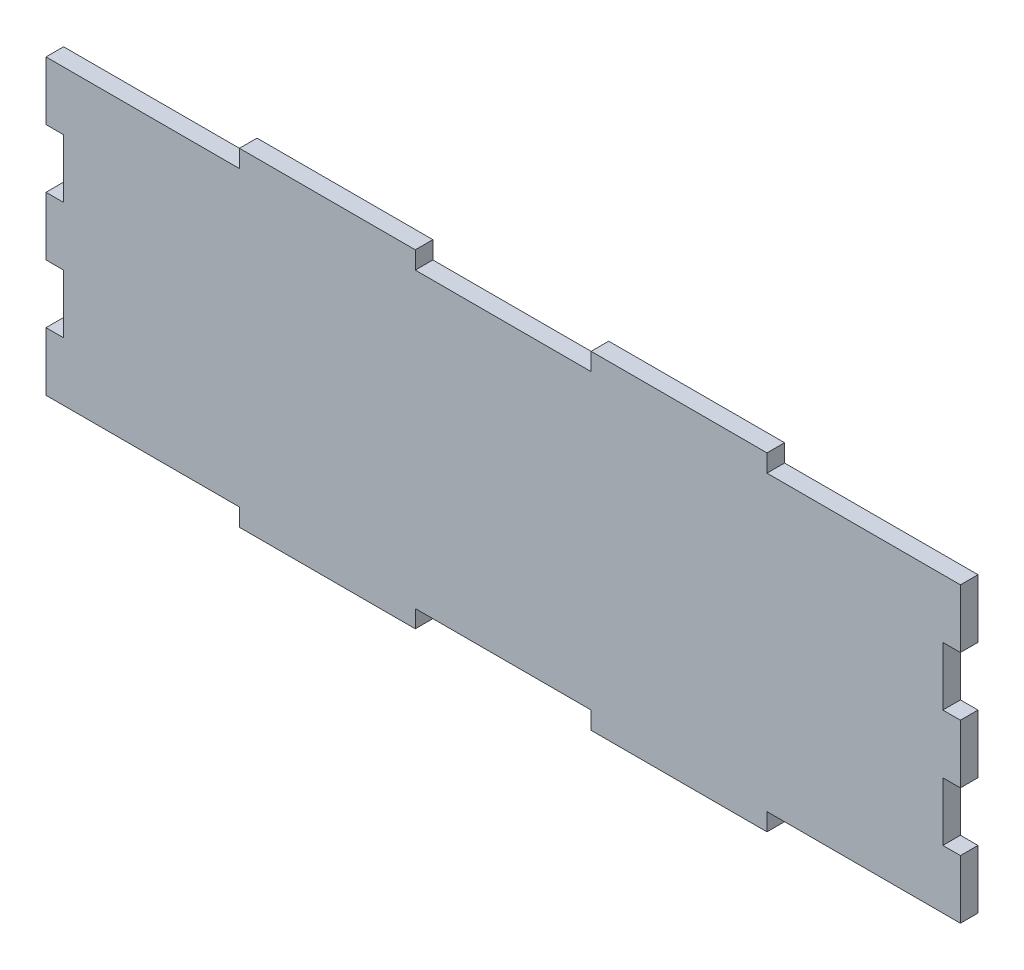
ISO-10303-21;
HEADER;
FILE_DESCRIPTION(('STEP AP214'),'2;1');
FILE_NAME('part.step','',(''),(''),'','','');
FILE_SCHEMA(('AUTOMOTIVE_DESIGN { 1 0 10303 214 1 1 1 1 }'));
ENDSEC;
DATA;
#1=APPLICATION_CONTEXT('core data for automotive mechanical design processes');
#2=APPLICATION_PROTOCOL_DEFINITION('international standard','automotive_design',2000,#1);
#3=PRODUCT_CONTEXT('',#1,'mechanical');
#4=PRODUCT('Part','Part','',(#3));
#5=PRODUCT_RELATED_PRODUCT_CATEGORY('part','',(#4));
#6=PRODUCT_DEFINITION_FORMATION('','',#4);
#7=PRODUCT_DEFINITION_CONTEXT('part definition',#1,'design');
#8=PRODUCT_DEFINITION('design','',#6,#7);
#9=PRODUCT_DEFINITION_SHAPE('','',#8);
#10=(LENGTH_UNIT() NAMED_UNIT(*) SI_UNIT(.MILLI.,.METRE.));
#11=(NAMED_UNIT(*) PLANE_ANGLE_UNIT() SI_UNIT($,.RADIAN.));
#12=(NAMED_UNIT(*) SI_UNIT($,.STERADIAN.) SOLID_ANGLE_UNIT());
#13=UNCERTAINTY_MEASURE_WITH_UNIT(LENGTH_MEASURE(1.E-05),#10,'distance_accuracy_value','');
#14=(GEOMETRIC_REPRESENTATION_CONTEXT(3) GLOBAL_UNCERTAINTY_ASSIGNED_CONTEXT((#13)) GLOBAL_UNIT_ASSIGNED_CONTEXT((#10,
#11,#12)) REPRESENTATION_CONTEXT('',''));
#15=CARTESIAN_POINT('',(0.,0.,0.));
#16=DIRECTION('',(0.,0.,1.));
#17=DIRECTION('',(1.,0.,0.));
#18=AXIS2_PLACEMENT_3D('',#15,#16,#17);
#19=CARTESIAN_POINT('',(45.,25.,3.));
#20=DIRECTION('',(0.,-1.,0.));
#21=DIRECTION('',(0.,0.,-1.));
#22=AXIS2_PLACEMENT_3D('',#19,#20,#21);
#23=PLANE('',#22);
#24=DIRECTION('',(-1.,0.,0.));
#25=VECTOR('',#24,1.);
#26=CARTESIAN_POINT('',(45.,25.,0.));
#27=LINE('',#26,#25);
#28=CARTESIAN_POINT('',(78.,25.,0.));
#29=VERTEX_POINT('',#28);
#30=CARTESIAN_POINT('',(45.,25.,0.));
#31=VERTEX_POINT('',#30);
#32=EDGE_CURVE('E178',#29,#31,#27,.T.);
#33=ORIENTED_EDGE('',*,*,#32,.T.);
#34=DIRECTION('',(0.,0.,-1.));
#35=VECTOR('',#34,1.);
#36=CARTESIAN_POINT('',(45.,25.,3.));
#37=LINE('',#36,#35);
#38=CARTESIAN_POINT('',(45.,25.,3.));
#39=VERTEX_POINT('',#38);
#40=EDGE_CURVE('E11',#39,#31,#37,.T.);
#41=ORIENTED_EDGE('',*,*,#40,.F.);
#42=DIRECTION('',(-1.,0.,0.));
#43=VECTOR('',#42,1.);
#44=CARTESIAN_POINT('',(75.,25.,3.));
#45=LINE('',#44,#43);
#46=CARTESIAN_POINT('',(78.,25.,3.));
#47=VERTEX_POINT('',#46);
#48=EDGE_CURVE('E184',#47,#39,#45,.T.);
#49=ORIENTED_EDGE('',*,*,#48,.F.);
#50=DIRECTION('',(0.,0.,-1.));
#51=VECTOR('',#50,1.);
#52=CARTESIAN_POINT('',(78.,25.,3.));
#53=LINE('',#52,#51);
#54=EDGE_CURVE('E306',#47,#29,#53,.T.);
#55=ORIENTED_EDGE('',*,*,#54,.T.);
#56=EDGE_LOOP('',(#33,#41,#49,#55));
#57=FACE_BOUND('',#56,.T.);
#58=ADVANCED_FACE('F41',(#57),#23,.F.);
#59=CARTESIAN_POINT('',(45.,25.,3.));
#60=DIRECTION('',(-1.,0.,0.));
#61=DIRECTION('',(0.,0.,1.));
#62=AXIS2_PLACEMENT_3D('',#59,#60,#61);
#63=PLANE('',#62);
#64=DIRECTION('',(0.,1.,0.));
#65=VECTOR('',#64,1.);
#66=CARTESIAN_POINT('',(45.,25.,0.));
#67=LINE('',#66,#65);
#68=CARTESIAN_POINT('',(45.,28.,0.));
#69=VERTEX_POINT('',#68);
#70=EDGE_CURVE('E312',#31,#69,#67,.T.);
#71=ORIENTED_EDGE('',*,*,#70,.T.);
#72=DIRECTION('',(0.,0.,-1.));
#73=VECTOR('',#72,1.);
#74=CARTESIAN_POINT('',(45.,28.,3.));
#75=LINE('',#74,#73);
#76=CARTESIAN_POINT('',(45.,28.,3.));
#77=VERTEX_POINT('',#76);
#78=EDGE_CURVE('E50',#77,#69,#75,.T.);
#79=ORIENTED_EDGE('',*,*,#78,.F.);
#80=DIRECTION('',(0.,1.,0.));
#81=VECTOR('',#80,1.);
#82=CARTESIAN_POINT('',(45.,25.,3.));
#83=LINE('',#82,#81);
#84=EDGE_CURVE('E671',#39,#77,#83,.T.);
#85=ORIENTED_EDGE('',*,*,#84,.F.);
#86=ORIENTED_EDGE('',*,*,#40,.T.);
#87=EDGE_LOOP('',(#71,#79,#85,#86));
#88=FACE_BOUND('',#87,.T.);
#89=ADVANCED_FACE('F676',(#88),#63,.F.);
#90=CARTESIAN_POINT('',(15.,28.,3.));
#91=DIRECTION('',(0.,-1.,0.));
#92=DIRECTION('',(0.,0.,-1.));
#93=AXIS2_PLACEMENT_3D('',#90,#91,#92);
#94=PLANE('',#93);
#95=DIRECTION('',(-1.,0.,0.));
#96=VECTOR('',#95,1.);
#97=CARTESIAN_POINT('',(15.,28.,0.));
#98=LINE('',#97,#96);
#99=CARTESIAN_POINT('',(15.,28.,0.));
#100=VERTEX_POINT('',#99);
#101=EDGE_CURVE('E315',#69,#100,#98,.T.);
#102=ORIENTED_EDGE('',*,*,#101,.T.);
#103=DIRECTION('',(0.,0.,-1.));
#104=VECTOR('',#103,1.);
#105=CARTESIAN_POINT('',(15.,28.,3.));
#106=LINE('',#105,#104);
#107=CARTESIAN_POINT('',(15.,28.,3.));
#108=VERTEX_POINT('',#107);
#109=EDGE_CURVE('E541',#108,#100,#106,.T.);
#110=ORIENTED_EDGE('',*,*,#109,.F.);
#111=DIRECTION('',(-1.,0.,0.));
#112=VECTOR('',#111,1.);
#113=CARTESIAN_POINT('',(15.,28.,3.));
#114=LINE('',#113,#112);
#115=EDGE_CURVE('E552',#77,#108,#114,.T.);
#116=ORIENTED_EDGE('',*,*,#115,.F.);
#117=ORIENTED_EDGE('',*,*,#78,.T.);
#118=EDGE_LOOP('',(#102,#110,#116,#117));
#119=FACE_BOUND('',#118,.T.);
#120=ADVANCED_FACE('F550',(#119),#94,.F.);
#121=CARTESIAN_POINT('',(15.,25.,3.));
#122=DIRECTION('',(1.,0.,0.));
#123=DIRECTION('',(0.,0.,-1.));
#124=AXIS2_PLACEMENT_3D('',#121,#122,#123);
#125=PLANE('',#124);
#126=DIRECTION('',(0.,-1.,0.));
#127=VECTOR('',#126,1.);
#128=CARTESIAN_POINT('',(15.,25.,0.));
#129=LINE('',#128,#127);
#130=CARTESIAN_POINT('',(15.,25.,0.));
#131=VERTEX_POINT('',#130);
#132=EDGE_CURVE('E318',#100,#131,#129,.T.);
#133=ORIENTED_EDGE('',*,*,#132,.T.);
#134=DIRECTION('',(0.,0.,-1.));
#135=VECTOR('',#134,1.);
#136=CARTESIAN_POINT('',(15.,25.,3.));
#137=LINE('',#136,#135);
#138=CARTESIAN_POINT('',(15.,25.,3.));
#139=VERTEX_POINT('',#138);
#140=EDGE_CURVE('E537',#139,#131,#137,.T.);
#141=ORIENTED_EDGE('',*,*,#140,.F.);
#142=DIRECTION('',(0.,-1.,0.));
#143=VECTOR('',#142,1.);
#144=CARTESIAN_POINT('',(15.,25.,3.));
#145=LINE('',#144,#143);
#146=EDGE_CURVE('E571',#108,#139,#145,.T.);
#147=ORIENTED_EDGE('',*,*,#146,.F.);
#148=ORIENTED_EDGE('',*,*,#109,.T.);
#149=EDGE_LOOP('',(#133,#141,#147,#148));
#150=FACE_BOUND('',#149,.T.);
#151=ADVANCED_FACE('F561',(#150),#125,.F.);
#152=CARTESIAN_POINT('',(-15.,25.,3.));
#153=DIRECTION('',(0.,-1.,0.));
#154=DIRECTION('',(0.,0.,-1.));
#155=AXIS2_PLACEMENT_3D('',#152,#153,#154);
#156=PLANE('',#155);
#157=DIRECTION('',(-1.,0.,0.));
#158=VECTOR('',#157,1.);
#159=CARTESIAN_POINT('',(-15.,25.,0.));
#160=LINE('',#159,#158);
#161=CARTESIAN_POINT('',(-15.,25.,0.));
#162=VERTEX_POINT('',#161);
#163=EDGE_CURVE('E321',#131,#162,#160,.T.);
#164=ORIENTED_EDGE('',*,*,#163,.T.);
#165=DIRECTION('',(0.,0.,-1.));
#166=VECTOR('',#165,1.);
#167=CARTESIAN_POINT('',(-15.,25.,3.));
#168=LINE('',#167,#166);
#169=CARTESIAN_POINT('',(-15.,25.,3.));
#170=VERTEX_POINT('',#169);
#171=EDGE_CURVE('E533',#170,#162,#168,.T.);
#172=ORIENTED_EDGE('',*,*,#171,.F.);
#173=DIRECTION('',(-1.,0.,0.));
#174=VECTOR('',#173,1.);
#175=CARTESIAN_POINT('',(-15.,25.,3.));
#176=LINE('',#175,#174);
#177=EDGE_CURVE('E567',#139,#170,#176,.T.);
#178=ORIENTED_EDGE('',*,*,#177,.F.);
#179=ORIENTED_EDGE('',*,*,#140,.T.);
#180=EDGE_LOOP('',(#164,#172,#178,#179));
#181=FACE_BOUND('',#180,.T.);
#182=ADVANCED_FACE('F565',(#181),#156,.F.);
#183=CARTESIAN_POINT('',(-15.,25.,3.));
#184=DIRECTION('',(-1.,0.,0.));
#185=DIRECTION('',(0.,0.,1.));
#186=AXIS2_PLACEMENT_3D('',#183,#184,#185);
#187=PLANE('',#186);
#188=DIRECTION('',(0.,1.,0.));
#189=VECTOR('',#188,1.);
#190=CARTESIAN_POINT('',(-15.,25.,0.));
#191=LINE('',#190,#189);
#192=CARTESIAN_POINT('',(-15.,28.,0.));
#193=VERTEX_POINT('',#192);
#194=EDGE_CURVE('E324',#162,#193,#191,.T.);
#195=ORIENTED_EDGE('',*,*,#194,.T.);
#196=DIRECTION('',(0.,0.,-1.));
#197=VECTOR('',#196,1.);
#198=CARTESIAN_POINT('',(-15.,28.,3.));
#199=LINE('',#198,#197);
#200=CARTESIAN_POINT('',(-15.,28.,3.));
#201=VERTEX_POINT('',#200);
#202=EDGE_CURVE('E529',#201,#193,#199,.T.);
#203=ORIENTED_EDGE('',*,*,#202,.F.);
#204=DIRECTION('',(0.,1.,0.));
#205=VECTOR('',#204,1.);
#206=CARTESIAN_POINT('',(-15.,25.,3.));
#207=LINE('',#206,#205);
#208=EDGE_CURVE('E570',#170,#201,#207,.T.);
#209=ORIENTED_EDGE('',*,*,#208,.F.);
#210=ORIENTED_EDGE('',*,*,#171,.T.);
#211=EDGE_LOOP('',(#195,#203,#209,#210));
#212=FACE_BOUND('',#211,.T.);
#213=ADVANCED_FACE('F688',(#212),#187,.F.);
#214=CARTESIAN_POINT('',(-45.,28.,3.));
#215=DIRECTION('',(0.,-1.,0.));
#216=DIRECTION('',(0.,0.,-1.));
#217=AXIS2_PLACEMENT_3D('',#214,#215,#216);
#218=PLANE('',#217);
#219=DIRECTION('',(-1.,0.,0.));
#220=VECTOR('',#219,1.);
#221=CARTESIAN_POINT('',(-45.,28.,0.));
#222=LINE('',#221,#220);
#223=CARTESIAN_POINT('',(-45.,28.,0.));
#224=VERTEX_POINT('',#223);
#225=EDGE_CURVE('E327',#193,#224,#222,.T.);
#226=ORIENTED_EDGE('',*,*,#225,.T.);
#227=DIRECTION('',(0.,0.,-1.));
#228=VECTOR('',#227,1.);
#229=CARTESIAN_POINT('',(-45.,28.,3.));
#230=LINE('',#229,#228);
#231=CARTESIAN_POINT('',(-45.,28.,3.));
#232=VERTEX_POINT('',#231);
#233=EDGE_CURVE('E525',#232,#224,#230,.T.);
#234=ORIENTED_EDGE('',*,*,#233,.F.);
#235=DIRECTION('',(-1.,0.,0.));
#236=VECTOR('',#235,1.);
#237=CARTESIAN_POINT('',(-45.,28.,3.));
#238=LINE('',#237,#236);
#239=EDGE_CURVE('E575',#201,#232,#238,.T.);
#240=ORIENTED_EDGE('',*,*,#239,.F.);
#241=ORIENTED_EDGE('',*,*,#202,.T.);
#242=EDGE_LOOP('',(#226,#234,#240,#241));
#243=FACE_BOUND('',#242,.T.);
#244=ADVANCED_FACE('F691',(#243),#218,.F.);
#245=CARTESIAN_POINT('',(-45.,25.,3.));
#246=DIRECTION('',(1.,0.,0.));
#247=DIRECTION('',(0.,0.,-1.));
#248=AXIS2_PLACEMENT_3D('',#245,#246,#247);
#249=PLANE('',#248);
#250=DIRECTION('',(0.,-1.,0.));
#251=VECTOR('',#250,1.);
#252=CARTESIAN_POINT('',(-45.,25.,0.));
#253=LINE('',#252,#251);
#254=CARTESIAN_POINT('',(-45.,25.,0.));
#255=VERTEX_POINT('',#254);
#256=EDGE_CURVE('E330',#224,#255,#253,.T.);
#257=ORIENTED_EDGE('',*,*,#256,.T.);
#258=DIRECTION('',(0.,0.,-1.));
#259=VECTOR('',#258,1.);
#260=CARTESIAN_POINT('',(-45.,25.,3.));
#261=LINE('',#260,#259);
#262=CARTESIAN_POINT('',(-45.,25.,3.));
#263=VERTEX_POINT('',#262);
#264=EDGE_CURVE('E521',#263,#255,#261,.T.);
#265=ORIENTED_EDGE('',*,*,#264,.F.);
#266=DIRECTION('',(0.,-1.,0.));
#267=VECTOR('',#266,1.);
#268=CARTESIAN_POINT('',(-45.,25.,3.));
#269=LINE('',#268,#267);
#270=EDGE_CURVE('E582',#232,#263,#269,.T.);
#271=ORIENTED_EDGE('',*,*,#270,.F.);
#272=ORIENTED_EDGE('',*,*,#233,.T.);
#273=EDGE_LOOP('',(#257,#265,#271,#272));
#274=FACE_BOUND('',#273,.T.);
#275=ADVANCED_FACE('F695',(#274),#249,.F.);
#276=CARTESIAN_POINT('',(-75.,25.,3.));
#277=DIRECTION('',(0.,-1.,0.));
#278=DIRECTION('',(1.,0.,0.));
#279=AXIS2_PLACEMENT_3D('',#276,#277,#278);
#280=PLANE('',#279);
#281=DIRECTION('',(-1.,0.,0.));
#282=VECTOR('',#281,1.);
#283=CARTESIAN_POINT('',(-75.,25.,0.));
#284=LINE('',#283,#282);
#285=CARTESIAN_POINT('',(-78.,25.,0.));
#286=VERTEX_POINT('',#285);
#287=EDGE_CURVE('E334',#255,#286,#284,.T.);
#288=ORIENTED_EDGE('',*,*,#287,.T.);
#289=DIRECTION('',(0.,0.,-1.));
#290=VECTOR('',#289,1.);
#291=CARTESIAN_POINT('',(-78.,25.,3.));
#292=LINE('',#291,#290);
#293=CARTESIAN_POINT('',(-78.,25.,3.));
#294=VERTEX_POINT('',#293);
#295=EDGE_CURVE('E517',#294,#286,#292,.T.);
#296=ORIENTED_EDGE('',*,*,#295,.F.);
#297=DIRECTION('',(-1.,0.,0.));
#298=VECTOR('',#297,1.);
#299=CARTESIAN_POINT('',(-75.,25.,3.));
#300=LINE('',#299,#298);
#301=EDGE_CURVE('E585',#263,#294,#300,.T.);
#302=ORIENTED_EDGE('',*,*,#301,.F.);
#303=ORIENTED_EDGE('',*,*,#264,.T.);
#304=EDGE_LOOP('',(#288,#296,#302,#303));
#305=FACE_BOUND('',#304,.T.);
#306=ADVANCED_FACE('F699',(#305),#280,.F.);
#307=CARTESIAN_POINT('',(-78.,25.,3.));
#308=DIRECTION('',(1.,0.,0.));
#309=DIRECTION('',(0.,0.,-1.));
#310=AXIS2_PLACEMENT_3D('',#307,#308,#309);
#311=PLANE('',#310);
#312=DIRECTION('',(0.,-1.,0.));
#313=VECTOR('',#312,1.);
#314=CARTESIAN_POINT('',(-78.,25.,0.));
#315=LINE('',#314,#313);
#316=CARTESIAN_POINT('',(-78.,15.,0.));
#317=VERTEX_POINT('',#316);
#318=EDGE_CURVE('E337',#286,#317,#315,.T.);
#319=ORIENTED_EDGE('',*,*,#318,.T.);
#320=DIRECTION('',(0.,0.,-1.));
#321=VECTOR('',#320,1.);
#322=CARTESIAN_POINT('',(-78.,15.,3.));
#323=LINE('',#322,#321);
#324=CARTESIAN_POINT('',(-78.,15.,3.));
#325=VERTEX_POINT('',#324);
#326=EDGE_CURVE('E513',#325,#317,#323,.T.);
#327=ORIENTED_EDGE('',*,*,#326,.F.);
#328=DIRECTION('',(0.,-1.,0.));
#329=VECTOR('',#328,1.);
#330=CARTESIAN_POINT('',(-78.,25.,3.));
#331=LINE('',#330,#329);
#332=EDGE_CURVE('E588',#294,#325,#331,.T.);
#333=ORIENTED_EDGE('',*,*,#332,.F.);
#334=ORIENTED_EDGE('',*,*,#295,.T.);
#335=EDGE_LOOP('',(#319,#327,#333,#334));
#336=FACE_BOUND('',#335,.T.);
#337=ADVANCED_FACE('F703',(#336),#311,.F.);
#338=CARTESIAN_POINT('',(-78.,15.,3.));
#339=DIRECTION('',(0.,1.,0.));
#340=DIRECTION('',(-1.,0.,0.));
#341=AXIS2_PLACEMENT_3D('',#338,#339,#340);
#342=PLANE('',#341);
#343=DIRECTION('',(1.,0.,0.));
#344=VECTOR('',#343,1.);
#345=CARTESIAN_POINT('',(-78.,15.,0.));
#346=LINE('',#345,#344);
#347=CARTESIAN_POINT('',(-75.,15.,0.));
#348=VERTEX_POINT('',#347);
#349=EDGE_CURVE('E340',#317,#348,#346,.T.);
#350=ORIENTED_EDGE('',*,*,#349,.T.);
#351=DIRECTION('',(0.,0.,-1.));
#352=VECTOR('',#351,1.);
#353=CARTESIAN_POINT('',(-75.,15.,3.));
#354=LINE('',#353,#352);
#355=CARTESIAN_POINT('',(-75.,15.,3.));
#356=VERTEX_POINT('',#355);
#357=EDGE_CURVE('E509',#356,#348,#354,.T.);
#358=ORIENTED_EDGE('',*,*,#357,.F.);
#359=DIRECTION('',(1.,0.,0.));
#360=VECTOR('',#359,1.);
#361=CARTESIAN_POINT('',(-78.,15.,3.));
#362=LINE('',#361,#360);
#363=EDGE_CURVE('E591',#325,#356,#362,.T.);
#364=ORIENTED_EDGE('',*,*,#363,.F.);
#365=ORIENTED_EDGE('',*,*,#326,.T.);
#366=EDGE_LOOP('',(#350,#358,#364,#365));
#367=FACE_BOUND('',#366,.T.);
#368=ADVANCED_FACE('F707',(#367),#342,.F.);
#369=CARTESIAN_POINT('',(-75.,15.,3.));
#370=DIRECTION('',(1.,0.,0.));
#371=DIRECTION('',(0.,0.,-1.));
#372=AXIS2_PLACEMENT_3D('',#369,#370,#371);
#373=PLANE('',#372);
#374=DIRECTION('',(0.,-1.,0.));
#375=VECTOR('',#374,1.);
#376=CARTESIAN_POINT('',(-75.,15.,0.));
#377=LINE('',#376,#375);
#378=CARTESIAN_POINT('',(-75.,4.99999999999999,0.));
#379=VERTEX_POINT('',#378);
#380=EDGE_CURVE('E343',#348,#379,#377,.T.);
#381=ORIENTED_EDGE('',*,*,#380,.T.);
#382=DIRECTION('',(0.,0.,-1.));
#383=VECTOR('',#382,1.);
#384=CARTESIAN_POINT('',(-75.,4.99999999999999,3.));
#385=LINE('',#384,#383);
#386=CARTESIAN_POINT('',(-75.,4.99999999999999,3.));
#387=VERTEX_POINT('',#386);
#388=EDGE_CURVE('E505',#387,#379,#385,.T.);
#389=ORIENTED_EDGE('',*,*,#388,.F.);
#390=DIRECTION('',(0.,-1.,0.));
#391=VECTOR('',#390,1.);
#392=CARTESIAN_POINT('',(-75.,15.,3.));
#393=LINE('',#392,#391);
#394=EDGE_CURVE('E594',#356,#387,#393,.T.);
#395=ORIENTED_EDGE('',*,*,#394,.F.);
#396=ORIENTED_EDGE('',*,*,#357,.T.);
#397=EDGE_LOOP('',(#381,#389,#395,#396));
#398=FACE_BOUND('',#397,.T.);
#399=ADVANCED_FACE('F711',(#398),#373,.F.);
#400=CARTESIAN_POINT('',(-75.,4.99999999999999,3.));
#401=DIRECTION('',(0.,-1.,0.));
#402=DIRECTION('',(0.,0.,-1.));
#403=AXIS2_PLACEMENT_3D('',#400,#401,#402);
#404=PLANE('',#403);
#405=DIRECTION('',(-1.,0.,0.));
#406=VECTOR('',#405,1.);
#407=CARTESIAN_POINT('',(-75.,4.99999999999999,0.));
#408=LINE('',#407,#406);
#409=CARTESIAN_POINT('',(-78.,4.99999999999999,0.));
#410=VERTEX_POINT('',#409);
#411=EDGE_CURVE('E346',#379,#410,#408,.T.);
#412=ORIENTED_EDGE('',*,*,#411,.T.);
#413=DIRECTION('',(0.,0.,-1.));
#414=VECTOR('',#413,1.);
#415=CARTESIAN_POINT('',(-78.,4.99999999999999,3.));
#416=LINE('',#415,#414);
#417=CARTESIAN_POINT('',(-78.,4.99999999999999,3.));
#418=VERTEX_POINT('',#417);
#419=EDGE_CURVE('E501',#418,#410,#416,.T.);
#420=ORIENTED_EDGE('',*,*,#419,.F.);
#421=DIRECTION('',(-1.,0.,0.));
#422=VECTOR('',#421,1.);
#423=CARTESIAN_POINT('',(-75.,4.99999999999999,3.));
#424=LINE('',#423,#422);
#425=EDGE_CURVE('E597',#387,#418,#424,.T.);
#426=ORIENTED_EDGE('',*,*,#425,.F.);
#427=ORIENTED_EDGE('',*,*,#388,.T.);
#428=EDGE_LOOP('',(#412,#420,#426,#427));
#429=FACE_BOUND('',#428,.T.);
#430=ADVANCED_FACE('F715',(#429),#404,.F.);
#431=CARTESIAN_POINT('',(-78.,4.99999999999999,3.));
#432=DIRECTION('',(1.,0.,0.));
#433=DIRECTION('',(0.,0.,-1.));
#434=AXIS2_PLACEMENT_3D('',#431,#432,#433);
#435=PLANE('',#434);
#436=DIRECTION('',(0.,-1.,0.));
#437=VECTOR('',#436,1.);
#438=CARTESIAN_POINT('',(-78.,4.99999999999999,0.));
#439=LINE('',#438,#437);
#440=CARTESIAN_POINT('',(-78.,-5.00000000000001,0.));
#441=VERTEX_POINT('',#440);
#442=EDGE_CURVE('E349',#410,#441,#439,.T.);
#443=ORIENTED_EDGE('',*,*,#442,.T.);
#444=DIRECTION('',(0.,0.,-1.));
#445=VECTOR('',#444,1.);
#446=CARTESIAN_POINT('',(-78.,-5.00000000000001,3.));
#447=LINE('',#446,#445);
#448=CARTESIAN_POINT('',(-78.,-5.00000000000001,3.));
#449=VERTEX_POINT('',#448);
#450=EDGE_CURVE('E497',#449,#441,#447,.T.);
#451=ORIENTED_EDGE('',*,*,#450,.F.);
#452=DIRECTION('',(0.,-1.,0.));
#453=VECTOR('',#452,1.);
#454=CARTESIAN_POINT('',(-78.,4.99999999999999,3.));
#455=LINE('',#454,#453);
#456=EDGE_CURVE('E600',#418,#449,#455,.T.);
#457=ORIENTED_EDGE('',*,*,#456,.F.);
#458=ORIENTED_EDGE('',*,*,#419,.T.);
#459=EDGE_LOOP('',(#443,#451,#457,#458));
#460=FACE_BOUND('',#459,.T.);
#461=ADVANCED_FACE('F719',(#460),#435,.F.);
#462=CARTESIAN_POINT('',(-78.,-5.00000000000001,3.));
#463=DIRECTION('',(0.,1.,0.));
#464=DIRECTION('',(-1.,0.,0.));
#465=AXIS2_PLACEMENT_3D('',#462,#463,#464);
#466=PLANE('',#465);
#467=DIRECTION('',(1.,0.,0.));
#468=VECTOR('',#467,1.);
#469=CARTESIAN_POINT('',(-78.,-5.00000000000001,0.));
#470=LINE('',#469,#468);
#471=CARTESIAN_POINT('',(-75.,-5.00000000000001,0.));
#472=VERTEX_POINT('',#471);
#473=EDGE_CURVE('E352',#441,#472,#470,.T.);
#474=ORIENTED_EDGE('',*,*,#473,.T.);
#475=DIRECTION('',(0.,0.,-1.));
#476=VECTOR('',#475,1.);
#477=CARTESIAN_POINT('',(-75.,-5.00000000000001,3.));
#478=LINE('',#477,#476);
#479=CARTESIAN_POINT('',(-75.,-5.00000000000001,3.));
#480=VERTEX_POINT('',#479);
#481=EDGE_CURVE('E493',#480,#472,#478,.T.);
#482=ORIENTED_EDGE('',*,*,#481,.F.);
#483=DIRECTION('',(1.,0.,0.));
#484=VECTOR('',#483,1.);
#485=CARTESIAN_POINT('',(-78.,-5.00000000000001,3.));
#486=LINE('',#485,#484);
#487=EDGE_CURVE('E603',#449,#480,#486,.T.);
#488=ORIENTED_EDGE('',*,*,#487,.F.);
#489=ORIENTED_EDGE('',*,*,#450,.T.);
#490=EDGE_LOOP('',(#474,#482,#488,#489));
#491=FACE_BOUND('',#490,.T.);
#492=ADVANCED_FACE('F723',(#491),#466,.F.);
#493=CARTESIAN_POINT('',(-75.,-5.00000000000001,3.));
#494=DIRECTION('',(1.,0.,0.));
#495=DIRECTION('',(0.,1.,0.));
#496=AXIS2_PLACEMENT_3D('',#493,#494,#495);
#497=PLANE('',#496);
#498=DIRECTION('',(0.,-1.,0.));
#499=VECTOR('',#498,1.);
#500=CARTESIAN_POINT('',(-75.,-5.00000000000001,0.));
#501=LINE('',#500,#499);
#502=CARTESIAN_POINT('',(-75.,-15.,0.));
#503=VERTEX_POINT('',#502);
#504=EDGE_CURVE('E355',#472,#503,#501,.T.);
#505=ORIENTED_EDGE('',*,*,#504,.T.);
#506=DIRECTION('',(0.,0.,-1.));
#507=VECTOR('',#506,1.);
#508=CARTESIAN_POINT('',(-75.,-15.,3.));
#509=LINE('',#508,#507);
#510=CARTESIAN_POINT('',(-75.,-15.,3.));
#511=VERTEX_POINT('',#510);
#512=EDGE_CURVE('E489',#511,#503,#509,.T.);
#513=ORIENTED_EDGE('',*,*,#512,.F.);
#514=DIRECTION('',(0.,-1.,0.));
#515=VECTOR('',#514,1.);
#516=CARTESIAN_POINT('',(-75.,-5.00000000000001,3.));
#517=LINE('',#516,#515);
#518=EDGE_CURVE('E606',#480,#511,#517,.T.);
#519=ORIENTED_EDGE('',*,*,#518,.F.);
#520=ORIENTED_EDGE('',*,*,#481,.T.);
#521=EDGE_LOOP('',(#505,#513,#519,#520));
#522=FACE_BOUND('',#521,.T.);
#523=ADVANCED_FACE('F727',(#522),#497,.F.);
#524=CARTESIAN_POINT('',(-75.,-15.,3.));
#525=DIRECTION('',(0.,-1.,0.));
#526=DIRECTION('',(1.,0.,0.));
#527=AXIS2_PLACEMENT_3D('',#524,#525,#526);
#528=PLANE('',#527);
#529=DIRECTION('',(-1.,0.,0.));
#530=VECTOR('',#529,1.);
#531=CARTESIAN_POINT('',(-75.,-15.,0.));
#532=LINE('',#531,#530);
#533=CARTESIAN_POINT('',(-78.,-15.,0.));
#534=VERTEX_POINT('',#533);
#535=EDGE_CURVE('E358',#503,#534,#532,.T.);
#536=ORIENTED_EDGE('',*,*,#535,.T.);
#537=DIRECTION('',(0.,0.,-1.));
#538=VECTOR('',#537,1.);
#539=CARTESIAN_POINT('',(-78.,-15.,3.));
#540=LINE('',#539,#538);
#541=CARTESIAN_POINT('',(-78.,-15.,3.));
#542=VERTEX_POINT('',#541);
#543=EDGE_CURVE('E485',#542,#534,#540,.T.);
#544=ORIENTED_EDGE('',*,*,#543,.F.);
#545=DIRECTION('',(-1.,0.,0.));
#546=VECTOR('',#545,1.);
#547=CARTESIAN_POINT('',(-75.,-15.,3.));
#548=LINE('',#547,#546);
#549=EDGE_CURVE('E609',#511,#542,#548,.T.);
#550=ORIENTED_EDGE('',*,*,#549,.F.);
#551=ORIENTED_EDGE('',*,*,#512,.T.);
#552=EDGE_LOOP('',(#536,#544,#550,#551));
#553=FACE_BOUND('',#552,.T.);
#554=ADVANCED_FACE('F731',(#553),#528,.F.);
#555=CARTESIAN_POINT('',(-78.,-15.,3.));
#556=DIRECTION('',(1.,0.,0.));
#557=DIRECTION('',(0.,0.,-1.));
#558=AXIS2_PLACEMENT_3D('',#555,#556,#557);
#559=PLANE('',#558);
#560=DIRECTION('',(0.,-1.,0.));
#561=VECTOR('',#560,1.);
#562=CARTESIAN_POINT('',(-78.,-15.,0.));
#563=LINE('',#562,#561);
#564=CARTESIAN_POINT('',(-78.,-25.,0.));
#565=VERTEX_POINT('',#564);
#566=EDGE_CURVE('E361',#534,#565,#563,.T.);
#567=ORIENTED_EDGE('',*,*,#566,.T.);
#568=DIRECTION('',(0.,0.,-1.));
#569=VECTOR('',#568,1.);
#570=CARTESIAN_POINT('',(-78.,-25.,3.));
#571=LINE('',#570,#569);
#572=CARTESIAN_POINT('',(-78.,-25.,3.));
#573=VERTEX_POINT('',#572);
#574=EDGE_CURVE('E481',#573,#565,#571,.T.);
#575=ORIENTED_EDGE('',*,*,#574,.F.);
#576=DIRECTION('',(0.,-1.,0.));
#577=VECTOR('',#576,1.);
#578=CARTESIAN_POINT('',(-78.,-15.,3.));
#579=LINE('',#578,#577);
#580=EDGE_CURVE('E612',#542,#573,#579,.T.);
#581=ORIENTED_EDGE('',*,*,#580,.F.);
#582=ORIENTED_EDGE('',*,*,#543,.T.);
#583=EDGE_LOOP('',(#567,#575,#581,#582));
#584=FACE_BOUND('',#583,.T.);
#585=ADVANCED_FACE('F735',(#584),#559,.F.);
#586=CARTESIAN_POINT('',(-75.,-25.,3.));
#587=DIRECTION('',(0.,1.,0.));
#588=DIRECTION('',(-1.,0.,0.));
#589=AXIS2_PLACEMENT_3D('',#586,#587,#588);
#590=PLANE('',#589);
#591=DIRECTION('',(1.,0.,0.));
#592=VECTOR('',#591,1.);
#593=CARTESIAN_POINT('',(-75.,-25.,0.));
#594=LINE('',#593,#592);
#595=CARTESIAN_POINT('',(-45.,-25.,0.));
#596=VERTEX_POINT('',#595);
#597=EDGE_CURVE('E365',#565,#596,#594,.T.);
#598=ORIENTED_EDGE('',*,*,#597,.T.);
#599=DIRECTION('',(0.,0.,-1.));
#600=VECTOR('',#599,1.);
#601=CARTESIAN_POINT('',(-45.,-25.,3.));
#602=LINE('',#601,#600);
#603=CARTESIAN_POINT('',(-45.,-25.,3.));
#604=VERTEX_POINT('',#603);
#605=EDGE_CURVE('E477',#604,#596,#602,.T.);
#606=ORIENTED_EDGE('',*,*,#605,.F.);
#607=DIRECTION('',(1.,0.,0.));
#608=VECTOR('',#607,1.);
#609=CARTESIAN_POINT('',(-78.,-25.,3.));
#610=LINE('',#609,#608);
#611=EDGE_CURVE('E615',#573,#604,#610,.T.);
#612=ORIENTED_EDGE('',*,*,#611,.F.);
#613=ORIENTED_EDGE('',*,*,#574,.T.);
#614=EDGE_LOOP('',(#598,#606,#612,#613));
#615=FACE_BOUND('',#614,.T.);
#616=ADVANCED_FACE('F739',(#615),#590,.F.);
#617=CARTESIAN_POINT('',(-45.,-25.,3.));
#618=DIRECTION('',(1.,0.,0.));
#619=DIRECTION('',(0.,0.,-1.));
#620=AXIS2_PLACEMENT_3D('',#617,#618,#619);
#621=PLANE('',#620);
#622=DIRECTION('',(0.,-1.,0.));
#623=VECTOR('',#622,1.);
#624=CARTESIAN_POINT('',(-45.,-25.,0.));
#625=LINE('',#624,#623);
#626=CARTESIAN_POINT('',(-45.,-28.,0.));
#627=VERTEX_POINT('',#626);
#628=EDGE_CURVE('E368',#596,#627,#625,.T.);
#629=ORIENTED_EDGE('',*,*,#628,.T.);
#630=DIRECTION('',(0.,0.,-1.));
#631=VECTOR('',#630,1.);
#632=CARTESIAN_POINT('',(-45.,-28.,3.));
#633=LINE('',#632,#631);
#634=CARTESIAN_POINT('',(-45.,-28.,3.));
#635=VERTEX_POINT('',#634);
#636=EDGE_CURVE('E473',#635,#627,#633,.T.);
#637=ORIENTED_EDGE('',*,*,#636,.F.);
#638=DIRECTION('',(0.,-1.,0.));
#639=VECTOR('',#638,1.);
#640=CARTESIAN_POINT('',(-45.,-25.,3.));
#641=LINE('',#640,#639);
#642=EDGE_CURVE('E618',#604,#635,#641,.T.);
#643=ORIENTED_EDGE('',*,*,#642,.F.);
#644=ORIENTED_EDGE('',*,*,#605,.T.);
#645=EDGE_LOOP('',(#629,#637,#643,#644));
#646=FACE_BOUND('',#645,.T.);
#647=ADVANCED_FACE('F743',(#646),#621,.F.);
#648=CARTESIAN_POINT('',(-45.,-28.,3.));
#649=DIRECTION('',(0.,1.,0.));
#650=DIRECTION('',(-1.,0.,0.));
#651=AXIS2_PLACEMENT_3D('',#648,#649,#650);
#652=PLANE('',#651);
#653=DIRECTION('',(1.,0.,0.));
#654=VECTOR('',#653,1.);
#655=CARTESIAN_POINT('',(-45.,-28.,0.));
#656=LINE('',#655,#654);
#657=CARTESIAN_POINT('',(-15.,-28.,0.));
#658=VERTEX_POINT('',#657);
#659=EDGE_CURVE('E371',#627,#658,#656,.T.);
#660=ORIENTED_EDGE('',*,*,#659,.T.);
#661=DIRECTION('',(0.,0.,-1.));
#662=VECTOR('',#661,1.);
#663=CARTESIAN_POINT('',(-15.,-28.,3.));
#664=LINE('',#663,#662);
#665=CARTESIAN_POINT('',(-15.,-28.,3.));
#666=VERTEX_POINT('',#665);
#667=EDGE_CURVE('E469',#666,#658,#664,.T.);
#668=ORIENTED_EDGE('',*,*,#667,.F.);
#669=DIRECTION('',(1.,0.,0.));
#670=VECTOR('',#669,1.);
#671=CARTESIAN_POINT('',(-45.,-28.,3.));
#672=LINE('',#671,#670);
#673=EDGE_CURVE('E621',#635,#666,#672,.T.);
#674=ORIENTED_EDGE('',*,*,#673,.F.);
#675=ORIENTED_EDGE('',*,*,#636,.T.);
#676=EDGE_LOOP('',(#660,#668,#674,#675));
#677=FACE_BOUND('',#676,.T.);
#678=ADVANCED_FACE('F747',(#677),#652,.F.);
#679=CARTESIAN_POINT('',(-15.,-25.,3.));
#680=DIRECTION('',(-1.,0.,0.));
#681=DIRECTION('',(0.,0.,1.));
#682=AXIS2_PLACEMENT_3D('',#679,#680,#681);
#683=PLANE('',#682);
#684=DIRECTION('',(0.,1.,0.));
#685=VECTOR('',#684,1.);
#686=CARTESIAN_POINT('',(-15.,-25.,0.));
#687=LINE('',#686,#685);
#688=CARTESIAN_POINT('',(-15.,-25.,0.));
#689=VERTEX_POINT('',#688);
#690=EDGE_CURVE('E374',#658,#689,#687,.T.);
#691=ORIENTED_EDGE('',*,*,#690,.T.);
#692=DIRECTION('',(0.,0.,-1.));
#693=VECTOR('',#692,1.);
#694=CARTESIAN_POINT('',(-15.,-25.,3.));
#695=LINE('',#694,#693);
#696=CARTESIAN_POINT('',(-15.,-25.,3.));
#697=VERTEX_POINT('',#696);
#698=EDGE_CURVE('E465',#697,#689,#695,.T.);
#699=ORIENTED_EDGE('',*,*,#698,.F.);
#700=DIRECTION('',(0.,1.,0.));
#701=VECTOR('',#700,1.);
#702=CARTESIAN_POINT('',(-15.,-25.,3.));
#703=LINE('',#702,#701);
#704=EDGE_CURVE('E624',#666,#697,#703,.T.);
#705=ORIENTED_EDGE('',*,*,#704,.F.);
#706=ORIENTED_EDGE('',*,*,#667,.T.);
#707=EDGE_LOOP('',(#691,#699,#705,#706));
#708=FACE_BOUND('',#707,.T.);
#709=ADVANCED_FACE('F751',(#708),#683,.F.);
#710=CARTESIAN_POINT('',(-15.,-25.,3.));
#711=DIRECTION('',(0.,1.,0.));
#712=DIRECTION('',(0.,0.,1.));
#713=AXIS2_PLACEMENT_3D('',#710,#711,#712);
#714=PLANE('',#713);
#715=DIRECTION('',(1.,0.,0.));
#716=VECTOR('',#715,1.);
#717=CARTESIAN_POINT('',(-15.,-25.,0.));
#718=LINE('',#717,#716);
#719=CARTESIAN_POINT('',(15.,-25.,0.));
#720=VERTEX_POINT('',#719);
#721=EDGE_CURVE('E377',#689,#720,#718,.T.);
#722=ORIENTED_EDGE('',*,*,#721,.T.);
#723=DIRECTION('',(0.,0.,-1.));
#724=VECTOR('',#723,1.);
#725=CARTESIAN_POINT('',(15.,-25.,3.));
#726=LINE('',#725,#724);
#727=CARTESIAN_POINT('',(15.,-25.,3.));
#728=VERTEX_POINT('',#727);
#729=EDGE_CURVE('E461',#728,#720,#726,.T.);
#730=ORIENTED_EDGE('',*,*,#729,.F.);
#731=DIRECTION('',(1.,0.,0.));
#732=VECTOR('',#731,1.);
#733=CARTESIAN_POINT('',(-15.,-25.,3.));
#734=LINE('',#733,#732);
#735=EDGE_CURVE('E627',#697,#728,#734,.T.);
#736=ORIENTED_EDGE('',*,*,#735,.F.);
#737=ORIENTED_EDGE('',*,*,#698,.T.);
#738=EDGE_LOOP('',(#722,#730,#736,#737));
#739=FACE_BOUND('',#738,.T.);
#740=ADVANCED_FACE('F755',(#739),#714,.F.);
#741=CARTESIAN_POINT('',(15.,-25.,3.));
#742=DIRECTION('',(1.,0.,0.));
#743=DIRECTION('',(0.,0.,-1.));
#744=AXIS2_PLACEMENT_3D('',#741,#742,#743);
#745=PLANE('',#744);
#746=DIRECTION('',(0.,-1.,0.));
#747=VECTOR('',#746,1.);
#748=CARTESIAN_POINT('',(15.,-25.,0.));
#749=LINE('',#748,#747);
#750=CARTESIAN_POINT('',(15.,-28.,0.));
#751=VERTEX_POINT('',#750);
#752=EDGE_CURVE('E380',#720,#751,#749,.T.);
#753=ORIENTED_EDGE('',*,*,#752,.T.);
#754=DIRECTION('',(0.,0.,-1.));
#755=VECTOR('',#754,1.);
#756=CARTESIAN_POINT('',(15.,-28.,3.));
#757=LINE('',#756,#755);
#758=CARTESIAN_POINT('',(15.,-28.,3.));
#759=VERTEX_POINT('',#758);
#760=EDGE_CURVE('E457',#759,#751,#757,.T.);
#761=ORIENTED_EDGE('',*,*,#760,.F.);
#762=DIRECTION('',(0.,-1.,0.));
#763=VECTOR('',#762,1.);
#764=CARTESIAN_POINT('',(15.,-25.,3.));
#765=LINE('',#764,#763);
#766=EDGE_CURVE('E630',#728,#759,#765,.T.);
#767=ORIENTED_EDGE('',*,*,#766,.F.);
#768=ORIENTED_EDGE('',*,*,#729,.T.);
#769=EDGE_LOOP('',(#753,#761,#767,#768));
#770=FACE_BOUND('',#769,.T.);
#771=ADVANCED_FACE('F759',(#770),#745,.F.);
#772=CARTESIAN_POINT('',(15.,-28.,3.));
#773=DIRECTION('',(0.,1.,0.));
#774=DIRECTION('',(0.,0.,1.));
#775=AXIS2_PLACEMENT_3D('',#772,#773,#774);
#776=PLANE('',#775);
#777=DIRECTION('',(1.,0.,0.));
#778=VECTOR('',#777,1.);
#779=CARTESIAN_POINT('',(15.,-28.,0.));
#780=LINE('',#779,#778);
#781=CARTESIAN_POINT('',(45.,-28.,0.));
#782=VERTEX_POINT('',#781);
#783=EDGE_CURVE('E383',#751,#782,#780,.T.);
#784=ORIENTED_EDGE('',*,*,#783,.T.);
#785=DIRECTION('',(0.,0.,-1.));
#786=VECTOR('',#785,1.);
#787=CARTESIAN_POINT('',(45.,-28.,3.));
#788=LINE('',#787,#786);
#789=CARTESIAN_POINT('',(45.,-28.,3.));
#790=VERTEX_POINT('',#789);
#791=EDGE_CURVE('E453',#790,#782,#788,.T.);
#792=ORIENTED_EDGE('',*,*,#791,.F.);
#793=DIRECTION('',(1.,0.,0.));
#794=VECTOR('',#793,1.);
#795=CARTESIAN_POINT('',(15.,-28.,3.));
#796=LINE('',#795,#794);
#797=EDGE_CURVE('E633',#759,#790,#796,.T.);
#798=ORIENTED_EDGE('',*,*,#797,.F.);
#799=ORIENTED_EDGE('',*,*,#760,.T.);
#800=EDGE_LOOP('',(#784,#792,#798,#799));
#801=FACE_BOUND('',#800,.T.);
#802=ADVANCED_FACE('F763',(#801),#776,.F.);
#803=CARTESIAN_POINT('',(45.,-25.,3.));
#804=DIRECTION('',(-1.,0.,0.));
#805=DIRECTION('',(0.,-1.,0.));
#806=AXIS2_PLACEMENT_3D('',#803,#804,#805);
#807=PLANE('',#806);
#808=DIRECTION('',(0.,1.,0.));
#809=VECTOR('',#808,1.);
#810=CARTESIAN_POINT('',(45.,-25.,0.));
#811=LINE('',#810,#809);
#812=CARTESIAN_POINT('',(45.,-25.,0.));
#813=VERTEX_POINT('',#812);
#814=EDGE_CURVE('E386',#782,#813,#811,.T.);
#815=ORIENTED_EDGE('',*,*,#814,.T.);
#816=DIRECTION('',(0.,0.,-1.));
#817=VECTOR('',#816,1.);
#818=CARTESIAN_POINT('',(45.,-25.,3.));
#819=LINE('',#818,#817);
#820=CARTESIAN_POINT('',(45.,-25.,3.));
#821=VERTEX_POINT('',#820);
#822=EDGE_CURVE('E449',#821,#813,#819,.T.);
#823=ORIENTED_EDGE('',*,*,#822,.F.);
#824=DIRECTION('',(0.,1.,0.));
#825=VECTOR('',#824,1.);
#826=CARTESIAN_POINT('',(45.,-25.,3.));
#827=LINE('',#826,#825);
#828=EDGE_CURVE('E636',#790,#821,#827,.T.);
#829=ORIENTED_EDGE('',*,*,#828,.F.);
#830=ORIENTED_EDGE('',*,*,#791,.T.);
#831=EDGE_LOOP('',(#815,#823,#829,#830));
#832=FACE_BOUND('',#831,.T.);
#833=ADVANCED_FACE('F767',(#832),#807,.F.);
#834=CARTESIAN_POINT('',(78.,-25.,3.));
#835=DIRECTION('',(0.,1.,0.));
#836=DIRECTION('',(-1.,0.,0.));
#837=AXIS2_PLACEMENT_3D('',#834,#835,#836);
#838=PLANE('',#837);
#839=DIRECTION('',(1.,0.,0.));
#840=VECTOR('',#839,1.);
#841=CARTESIAN_POINT('',(78.,-25.,0.));
#842=LINE('',#841,#840);
#843=CARTESIAN_POINT('',(78.,-25.,0.));
#844=VERTEX_POINT('',#843);
#845=EDGE_CURVE('E390',#813,#844,#842,.T.);
#846=ORIENTED_EDGE('',*,*,#845,.T.);
#847=DIRECTION('',(0.,0.,-1.));
#848=VECTOR('',#847,1.);
#849=CARTESIAN_POINT('',(78.,-25.,3.));
#850=LINE('',#849,#848);
#851=CARTESIAN_POINT('',(78.,-25.,3.));
#852=VERTEX_POINT('',#851);
#853=EDGE_CURVE('E445',#852,#844,#850,.T.);
#854=ORIENTED_EDGE('',*,*,#853,.F.);
#855=DIRECTION('',(1.,0.,0.));
#856=VECTOR('',#855,1.);
#857=CARTESIAN_POINT('',(45.,-25.,3.));
#858=LINE('',#857,#856);
#859=EDGE_CURVE('E639',#821,#852,#858,.T.);
#860=ORIENTED_EDGE('',*,*,#859,.F.);
#861=ORIENTED_EDGE('',*,*,#822,.T.);
#862=EDGE_LOOP('',(#846,#854,#860,#861));
#863=FACE_BOUND('',#862,.T.);
#864=ADVANCED_FACE('F771',(#863),#838,.F.);
#865=CARTESIAN_POINT('',(78.,-15.,3.));
#866=DIRECTION('',(-1.,0.,0.));
#867=DIRECTION('',(0.,0.,1.));
#868=AXIS2_PLACEMENT_3D('',#865,#866,#867);
#869=PLANE('',#868);
#870=DIRECTION('',(0.,1.,0.));
#871=VECTOR('',#870,1.);
#872=CARTESIAN_POINT('',(78.,-15.,0.));
#873=LINE('',#872,#871);
#874=CARTESIAN_POINT('',(78.,-15.,0.));
#875=VERTEX_POINT('',#874);
#876=EDGE_CURVE('E393',#844,#875,#873,.T.);
#877=ORIENTED_EDGE('',*,*,#876,.T.);
#878=DIRECTION('',(0.,0.,-1.));
#879=VECTOR('',#878,1.);
#880=CARTESIAN_POINT('',(78.,-15.,3.));
#881=LINE('',#880,#879);
#882=CARTESIAN_POINT('',(78.,-15.,3.));
#883=VERTEX_POINT('',#882);
#884=EDGE_CURVE('E441',#883,#875,#881,.T.);
#885=ORIENTED_EDGE('',*,*,#884,.F.);
#886=DIRECTION('',(0.,1.,0.));
#887=VECTOR('',#886,1.);
#888=CARTESIAN_POINT('',(78.,-15.,3.));
#889=LINE('',#888,#887);
#890=EDGE_CURVE('E642',#852,#883,#889,.T.);
#891=ORIENTED_EDGE('',*,*,#890,.F.);
#892=ORIENTED_EDGE('',*,*,#853,.T.);
#893=EDGE_LOOP('',(#877,#885,#891,#892));
#894=FACE_BOUND('',#893,.T.);
#895=ADVANCED_FACE('F775',(#894),#869,.F.);
#896=CARTESIAN_POINT('',(75.,-15.,3.));
#897=DIRECTION('',(0.,-1.,0.));
#898=DIRECTION('',(1.,0.,0.));
#899=AXIS2_PLACEMENT_3D('',#896,#897,#898);
#900=PLANE('',#899);
#901=DIRECTION('',(-1.,0.,0.));
#902=VECTOR('',#901,1.);
#903=CARTESIAN_POINT('',(75.,-15.,0.));
#904=LINE('',#903,#902);
#905=CARTESIAN_POINT('',(75.,-15.,0.));
#906=VERTEX_POINT('',#905);
#907=EDGE_CURVE('E396',#875,#906,#904,.T.);
#908=ORIENTED_EDGE('',*,*,#907,.T.);
#909=DIRECTION('',(0.,0.,-1.));
#910=VECTOR('',#909,1.);
#911=CARTESIAN_POINT('',(75.,-15.,3.));
#912=LINE('',#911,#910);
#913=CARTESIAN_POINT('',(75.,-15.,3.));
#914=VERTEX_POINT('',#913);
#915=EDGE_CURVE('E437',#914,#906,#912,.T.);
#916=ORIENTED_EDGE('',*,*,#915,.F.);
#917=DIRECTION('',(-1.,0.,0.));
#918=VECTOR('',#917,1.);
#919=CARTESIAN_POINT('',(75.,-15.,3.));
#920=LINE('',#919,#918);
#921=EDGE_CURVE('E645',#883,#914,#920,.T.);
#922=ORIENTED_EDGE('',*,*,#921,.F.);
#923=ORIENTED_EDGE('',*,*,#884,.T.);
#924=EDGE_LOOP('',(#908,#916,#922,#923));
#925=FACE_BOUND('',#924,.T.);
#926=ADVANCED_FACE('F779',(#925),#900,.F.);
#927=CARTESIAN_POINT('',(75.,-5.00000000000001,3.));
#928=DIRECTION('',(-1.,0.,0.));
#929=DIRECTION('',(0.,0.,1.));
#930=AXIS2_PLACEMENT_3D('',#927,#928,#929);
#931=PLANE('',#930);
#932=DIRECTION('',(0.,1.,0.));
#933=VECTOR('',#932,1.);
#934=CARTESIAN_POINT('',(75.,-5.00000000000001,0.));
#935=LINE('',#934,#933);
#936=CARTESIAN_POINT('',(75.,-5.00000000000001,0.));
#937=VERTEX_POINT('',#936);
#938=EDGE_CURVE('E399',#906,#937,#935,.T.);
#939=ORIENTED_EDGE('',*,*,#938,.T.);
#940=DIRECTION('',(0.,0.,-1.));
#941=VECTOR('',#940,1.);
#942=CARTESIAN_POINT('',(75.,-5.00000000000001,3.));
#943=LINE('',#942,#941);
#944=CARTESIAN_POINT('',(75.,-5.00000000000001,3.));
#945=VERTEX_POINT('',#944);
#946=EDGE_CURVE('E433',#945,#937,#943,.T.);
#947=ORIENTED_EDGE('',*,*,#946,.F.);
#948=DIRECTION('',(0.,1.,0.));
#949=VECTOR('',#948,1.);
#950=CARTESIAN_POINT('',(75.,-5.00000000000001,3.));
#951=LINE('',#950,#949);
#952=EDGE_CURVE('E648',#914,#945,#951,.T.);
#953=ORIENTED_EDGE('',*,*,#952,.F.);
#954=ORIENTED_EDGE('',*,*,#915,.T.);
#955=EDGE_LOOP('',(#939,#947,#953,#954));
#956=FACE_BOUND('',#955,.T.);
#957=ADVANCED_FACE('F783',(#956),#931,.F.);
#958=CARTESIAN_POINT('',(78.,-5.,3.));
#959=DIRECTION('',(0.,1.,0.));
#960=DIRECTION('',(-1.,0.,0.));
#961=AXIS2_PLACEMENT_3D('',#958,#959,#960);
#962=PLANE('',#961);
#963=DIRECTION('',(1.,0.,0.));
#964=VECTOR('',#963,1.);
#965=CARTESIAN_POINT('',(78.,-5.,0.));
#966=LINE('',#965,#964);
#967=CARTESIAN_POINT('',(78.,-5.,0.));
#968=VERTEX_POINT('',#967);
#969=EDGE_CURVE('E402',#937,#968,#966,.T.);
#970=ORIENTED_EDGE('',*,*,#969,.T.);
#971=DIRECTION('',(0.,0.,-1.));
#972=VECTOR('',#971,1.);
#973=CARTESIAN_POINT('',(78.,-5.,3.));
#974=LINE('',#973,#972);
#975=CARTESIAN_POINT('',(78.,-5.,3.));
#976=VERTEX_POINT('',#975);
#977=EDGE_CURVE('E429',#976,#968,#974,.T.);
#978=ORIENTED_EDGE('',*,*,#977,.F.);
#979=DIRECTION('',(1.,0.,0.));
#980=VECTOR('',#979,1.);
#981=CARTESIAN_POINT('',(78.,-5.,3.));
#982=LINE('',#981,#980);
#983=EDGE_CURVE('E651',#945,#976,#982,.T.);
#984=ORIENTED_EDGE('',*,*,#983,.F.);
#985=ORIENTED_EDGE('',*,*,#946,.T.);
#986=EDGE_LOOP('',(#970,#978,#984,#985));
#987=FACE_BOUND('',#986,.T.);
#988=ADVANCED_FACE('F787',(#987),#962,.F.);
#989=CARTESIAN_POINT('',(78.,4.99999999999999,3.));
#990=DIRECTION('',(-1.,0.,0.));
#991=DIRECTION('',(0.,0.,1.));
#992=AXIS2_PLACEMENT_3D('',#989,#990,#991);
#993=PLANE('',#992);
#994=DIRECTION('',(0.,1.,0.));
#995=VECTOR('',#994,1.);
#996=CARTESIAN_POINT('',(78.,4.99999999999999,0.));
#997=LINE('',#996,#995);
#998=CARTESIAN_POINT('',(78.,4.99999999999999,0.));
#999=VERTEX_POINT('',#998);
#1000=EDGE_CURVE('E405',#968,#999,#997,.T.);
#1001=ORIENTED_EDGE('',*,*,#1000,.T.);
#1002=DIRECTION('',(0.,0.,-1.));
#1003=VECTOR('',#1002,1.);
#1004=CARTESIAN_POINT('',(78.,4.99999999999999,3.));
#1005=LINE('',#1004,#1003);
#1006=CARTESIAN_POINT('',(78.,4.99999999999999,3.));
#1007=VERTEX_POINT('',#1006);
#1008=EDGE_CURVE('E425',#1007,#999,#1005,.T.);
#1009=ORIENTED_EDGE('',*,*,#1008,.F.);
#1010=DIRECTION('',(0.,1.,0.));
#1011=VECTOR('',#1010,1.);
#1012=CARTESIAN_POINT('',(78.,4.99999999999999,3.));
#1013=LINE('',#1012,#1011);
#1014=EDGE_CURVE('E654',#976,#1007,#1013,.T.);
#1015=ORIENTED_EDGE('',*,*,#1014,.F.);
#1016=ORIENTED_EDGE('',*,*,#977,.T.);
#1017=EDGE_LOOP('',(#1001,#1009,#1015,#1016));
#1018=FACE_BOUND('',#1017,.T.);
#1019=ADVANCED_FACE('F662',(#1018),#993,.F.);
#1020=CARTESIAN_POINT('',(75.,4.99999999999999,3.));
#1021=DIRECTION('',(0.,-1.,0.));
#1022=DIRECTION('',(1.,0.,0.));
#1023=AXIS2_PLACEMENT_3D('',#1020,#1021,#1022);
#1024=PLANE('',#1023);
#1025=DIRECTION('',(-1.,0.,0.));
#1026=VECTOR('',#1025,1.);
#1027=CARTESIAN_POINT('',(75.,4.99999999999999,0.));
#1028=LINE('',#1027,#1026);
#1029=CARTESIAN_POINT('',(75.,4.99999999999999,0.));
#1030=VERTEX_POINT('',#1029);
#1031=EDGE_CURVE('E408',#999,#1030,#1028,.T.);
#1032=ORIENTED_EDGE('',*,*,#1031,.T.);
#1033=DIRECTION('',(0.,0.,-1.));
#1034=VECTOR('',#1033,1.);
#1035=CARTESIAN_POINT('',(75.,4.99999999999999,3.));
#1036=LINE('',#1035,#1034);
#1037=CARTESIAN_POINT('',(75.,4.99999999999999,3.));
#1038=VERTEX_POINT('',#1037);
#1039=EDGE_CURVE('E299',#1038,#1030,#1036,.T.);
#1040=ORIENTED_EDGE('',*,*,#1039,.F.);
#1041=DIRECTION('',(-1.,0.,0.));
#1042=VECTOR('',#1041,1.);
#1043=CARTESIAN_POINT('',(75.,4.99999999999999,3.));
#1044=LINE('',#1043,#1042);
#1045=EDGE_CURVE('E288',#1007,#1038,#1044,.T.);
#1046=ORIENTED_EDGE('',*,*,#1045,.F.);
#1047=ORIENTED_EDGE('',*,*,#1008,.T.);
#1048=EDGE_LOOP('',(#1032,#1040,#1046,#1047));
#1049=FACE_BOUND('',#1048,.T.);
#1050=ADVANCED_FACE('F666',(#1049),#1024,.F.);
#1051=CARTESIAN_POINT('',(75.,15.,3.));
#1052=DIRECTION('',(-1.,0.,0.));
#1053=DIRECTION('',(0.,0.,1.));
#1054=AXIS2_PLACEMENT_3D('',#1051,#1052,#1053);
#1055=PLANE('',#1054);
#1056=DIRECTION('',(0.,1.,0.));
#1057=VECTOR('',#1056,1.);
#1058=CARTESIAN_POINT('',(75.,15.,0.));
#1059=LINE('',#1058,#1057);
#1060=CARTESIAN_POINT('',(75.,15.,0.));
#1061=VERTEX_POINT('',#1060);
#1062=EDGE_CURVE('E297',#1030,#1061,#1059,.T.);
#1063=ORIENTED_EDGE('',*,*,#1062,.T.);
#1064=DIRECTION('',(0.,0.,-1.));
#1065=VECTOR('',#1064,1.);
#1066=CARTESIAN_POINT('',(75.,15.,3.));
#1067=LINE('',#1066,#1065);
#1068=CARTESIAN_POINT('',(75.,15.,3.));
#1069=VERTEX_POINT('',#1068);
#1070=EDGE_CURVE('E294',#1069,#1061,#1067,.T.);
#1071=ORIENTED_EDGE('',*,*,#1070,.F.);
#1072=DIRECTION('',(0.,1.,0.));
#1073=VECTOR('',#1072,1.);
#1074=CARTESIAN_POINT('',(75.,15.,3.));
#1075=LINE('',#1074,#1073);
#1076=EDGE_CURVE('E282',#1038,#1069,#1075,.T.);
#1077=ORIENTED_EDGE('',*,*,#1076,.F.);
#1078=ORIENTED_EDGE('',*,*,#1039,.T.);
#1079=EDGE_LOOP('',(#1063,#1071,#1077,#1078));
#1080=FACE_BOUND('',#1079,.T.);
#1081=ADVANCED_FACE('F295',(#1080),#1055,.F.);
#1082=CARTESIAN_POINT('',(78.,15.,3.));
#1083=DIRECTION('',(0.,1.,0.));
#1084=DIRECTION('',(-1.,0.,0.));
#1085=AXIS2_PLACEMENT_3D('',#1082,#1083,#1084);
#1086=PLANE('',#1085);
#1087=DIRECTION('',(1.,0.,0.));
#1088=VECTOR('',#1087,1.);
#1089=CARTESIAN_POINT('',(78.,15.,0.));
#1090=LINE('',#1089,#1088);
#1091=CARTESIAN_POINT('',(78.,15.,0.));
#1092=VERTEX_POINT('',#1091);
#1093=EDGE_CURVE('E171',#1061,#1092,#1090,.T.);
#1094=ORIENTED_EDGE('',*,*,#1093,.T.);
#1095=DIRECTION('',(0.,0.,-1.));
#1096=VECTOR('',#1095,1.);
#1097=CARTESIAN_POINT('',(78.,15.,3.));
#1098=LINE('',#1097,#1096);
#1099=CARTESIAN_POINT('',(78.,15.,3.));
#1100=VERTEX_POINT('',#1099);
#1101=EDGE_CURVE('E300',#1100,#1092,#1098,.T.);
#1102=ORIENTED_EDGE('',*,*,#1101,.F.);
#1103=DIRECTION('',(1.,0.,0.));
#1104=VECTOR('',#1103,1.);
#1105=CARTESIAN_POINT('',(78.,15.,3.));
#1106=LINE('',#1105,#1104);
#1107=EDGE_CURVE('E286',#1069,#1100,#1106,.T.);
#1108=ORIENTED_EDGE('',*,*,#1107,.F.);
#1109=ORIENTED_EDGE('',*,*,#1070,.T.);
#1110=EDGE_LOOP('',(#1094,#1102,#1108,#1109));
#1111=FACE_BOUND('',#1110,.T.);
#1112=ADVANCED_FACE('F302',(#1111),#1086,.F.);
#1113=CARTESIAN_POINT('',(78.,25.,3.));
#1114=DIRECTION('',(-1.,0.,0.));
#1115=DIRECTION('',(0.,-1.,0.));
#1116=AXIS2_PLACEMENT_3D('',#1113,#1114,#1115);
#1117=PLANE('',#1116);
#1118=DIRECTION('',(0.,1.,0.));
#1119=VECTOR('',#1118,1.);
#1120=CARTESIAN_POINT('',(78.,25.,0.));
#1121=LINE('',#1120,#1119);
#1122=EDGE_CURVE('E415',#1092,#29,#1121,.T.);
#1123=ORIENTED_EDGE('',*,*,#1122,.T.);
#1124=ORIENTED_EDGE('',*,*,#54,.F.);
#1125=DIRECTION('',(0.,1.,0.));
#1126=VECTOR('',#1125,1.);
#1127=CARTESIAN_POINT('',(78.,25.,3.));
#1128=LINE('',#1127,#1126);
#1129=EDGE_CURVE('E58',#1100,#47,#1128,.T.);
#1130=ORIENTED_EDGE('',*,*,#1129,.F.);
#1131=ORIENTED_EDGE('',*,*,#1101,.T.);
#1132=EDGE_LOOP('',(#1123,#1124,#1130,#1131));
#1133=FACE_BOUND('',#1132,.T.);
#1134=ADVANCED_FACE('F668',(#1133),#1117,.F.);
#1135=CARTESIAN_POINT('',(0.,0.,3.));
#1136=DIRECTION('',(0.,0.,-1.));
#1137=DIRECTION('',(-1.,0.,0.));
#1138=AXIS2_PLACEMENT_3D('',#1135,#1136,#1137);
#1139=PLANE('',#1138);
#1140=ORIENTED_EDGE('',*,*,#48,.T.);
#1141=ORIENTED_EDGE('',*,*,#84,.T.);
#1142=ORIENTED_EDGE('',*,*,#115,.T.);
#1143=ORIENTED_EDGE('',*,*,#146,.T.);
#1144=ORIENTED_EDGE('',*,*,#177,.T.);
#1145=ORIENTED_EDGE('',*,*,#208,.T.);
#1146=ORIENTED_EDGE('',*,*,#239,.T.);
#1147=ORIENTED_EDGE('',*,*,#270,.T.);
#1148=ORIENTED_EDGE('',*,*,#301,.T.);
#1149=ORIENTED_EDGE('',*,*,#332,.T.);
#1150=ORIENTED_EDGE('',*,*,#363,.T.);
#1151=ORIENTED_EDGE('',*,*,#394,.T.);
#1152=ORIENTED_EDGE('',*,*,#425,.T.);
#1153=ORIENTED_EDGE('',*,*,#456,.T.);
#1154=ORIENTED_EDGE('',*,*,#487,.T.);
#1155=ORIENTED_EDGE('',*,*,#518,.T.);
#1156=ORIENTED_EDGE('',*,*,#549,.T.);
#1157=ORIENTED_EDGE('',*,*,#580,.T.);
#1158=ORIENTED_EDGE('',*,*,#611,.T.);
#1159=ORIENTED_EDGE('',*,*,#642,.T.);
#1160=ORIENTED_EDGE('',*,*,#673,.T.);
#1161=ORIENTED_EDGE('',*,*,#704,.T.);
#1162=ORIENTED_EDGE('',*,*,#735,.T.);
#1163=ORIENTED_EDGE('',*,*,#766,.T.);
#1164=ORIENTED_EDGE('',*,*,#797,.T.);
#1165=ORIENTED_EDGE('',*,*,#828,.T.);
#1166=ORIENTED_EDGE('',*,*,#859,.T.);
#1167=ORIENTED_EDGE('',*,*,#890,.T.);
#1168=ORIENTED_EDGE('',*,*,#921,.T.);
#1169=ORIENTED_EDGE('',*,*,#952,.T.);
#1170=ORIENTED_EDGE('',*,*,#983,.T.);
#1171=ORIENTED_EDGE('',*,*,#1014,.T.);
#1172=ORIENTED_EDGE('',*,*,#1045,.T.);
#1173=ORIENTED_EDGE('',*,*,#1076,.T.);
#1174=ORIENTED_EDGE('',*,*,#1107,.T.);
#1175=ORIENTED_EDGE('',*,*,#1129,.T.);
#1176=EDGE_LOOP('',(#1140,#1141,#1142,#1143,#1144,#1145,#1146,#1147,#1148,#1149,#1150,#1151,
#1152,#1153,#1154,#1155,#1156,#1157,#1158,#1159,#1160,#1161,#1162,#1163,#1164,#1165,#1166,#1167,
#1168,#1169,#1170,#1171,#1172,#1173,#1174,#1175));
#1177=FACE_BOUND('',#1176,.T.);
#1178=ADVANCED_FACE('F284',(#1177),#1139,.F.);
#1179=CARTESIAN_POINT('',(0.,0.,0.));
#1180=DIRECTION('',(0.,0.,-1.));
#1181=DIRECTION('',(-1.,0.,0.));
#1182=AXIS2_PLACEMENT_3D('',#1179,#1180,#1181);
#1183=PLANE('',#1182);
#1184=ORIENTED_EDGE('',*,*,#32,.F.);
#1185=ORIENTED_EDGE('',*,*,#1122,.F.);
#1186=ORIENTED_EDGE('',*,*,#1093,.F.);
#1187=ORIENTED_EDGE('',*,*,#1062,.F.);
#1188=ORIENTED_EDGE('',*,*,#1031,.F.);
#1189=ORIENTED_EDGE('',*,*,#1000,.F.);
#1190=ORIENTED_EDGE('',*,*,#969,.F.);
#1191=ORIENTED_EDGE('',*,*,#938,.F.);
#1192=ORIENTED_EDGE('',*,*,#907,.F.);
#1193=ORIENTED_EDGE('',*,*,#876,.F.);
#1194=ORIENTED_EDGE('',*,*,#845,.F.);
#1195=ORIENTED_EDGE('',*,*,#814,.F.);
#1196=ORIENTED_EDGE('',*,*,#783,.F.);
#1197=ORIENTED_EDGE('',*,*,#752,.F.);
#1198=ORIENTED_EDGE('',*,*,#721,.F.);
#1199=ORIENTED_EDGE('',*,*,#690,.F.);
#1200=ORIENTED_EDGE('',*,*,#659,.F.);
#1201=ORIENTED_EDGE('',*,*,#628,.F.);
#1202=ORIENTED_EDGE('',*,*,#597,.F.);
#1203=ORIENTED_EDGE('',*,*,#566,.F.);
#1204=ORIENTED_EDGE('',*,*,#535,.F.);
#1205=ORIENTED_EDGE('',*,*,#504,.F.);
#1206=ORIENTED_EDGE('',*,*,#473,.F.);
#1207=ORIENTED_EDGE('',*,*,#442,.F.);
#1208=ORIENTED_EDGE('',*,*,#411,.F.);
#1209=ORIENTED_EDGE('',*,*,#380,.F.);
#1210=ORIENTED_EDGE('',*,*,#349,.F.);
#1211=ORIENTED_EDGE('',*,*,#318,.F.);
#1212=ORIENTED_EDGE('',*,*,#287,.F.);
#1213=ORIENTED_EDGE('',*,*,#256,.F.);
#1214=ORIENTED_EDGE('',*,*,#225,.F.);
#1215=ORIENTED_EDGE('',*,*,#194,.F.);
#1216=ORIENTED_EDGE('',*,*,#163,.F.);
#1217=ORIENTED_EDGE('',*,*,#132,.F.);
#1218=ORIENTED_EDGE('',*,*,#101,.F.);
#1219=ORIENTED_EDGE('',*,*,#70,.F.);
#1220=EDGE_LOOP('',(#1184,#1185,#1186,#1187,#1188,#1189,#1190,#1191,#1192,#1193,#1194,#1195,
#1196,#1197,#1198,#1199,#1200,#1201,#1202,#1203,#1204,#1205,#1206,#1207,#1208,#1209,#1210,#1211,
#1212,#1213,#1214,#1215,#1216,#1217,#1218,#1219));
#1221=FACE_BOUND('',#1220,.T.);
#1222=ADVANCED_FACE('F556',(#1221),#1183,.T.);
#1223=CLOSED_SHELL('',(#58,#89,#120,#151,#182,#213,#244,#275,#306,#337,#368,#399,#430,#461,#492,
#523,#554,#585,#616,#647,#678,#709,#740,#771,#802,#833,#864,#895,#926,#957,#988,#1019,#1050,
#1081,#1112,#1134,#1178,#1222));
#1224=MANIFOLD_SOLID_BREP('B2',#1223);
#1225=ADVANCED_BREP_SHAPE_REPRESENTATION('',(#18,#1224),#14);
#1226=SHAPE_DEFINITION_REPRESENTATION(#9,#1225);
ENDSEC;
END-ISO-10303-21;
